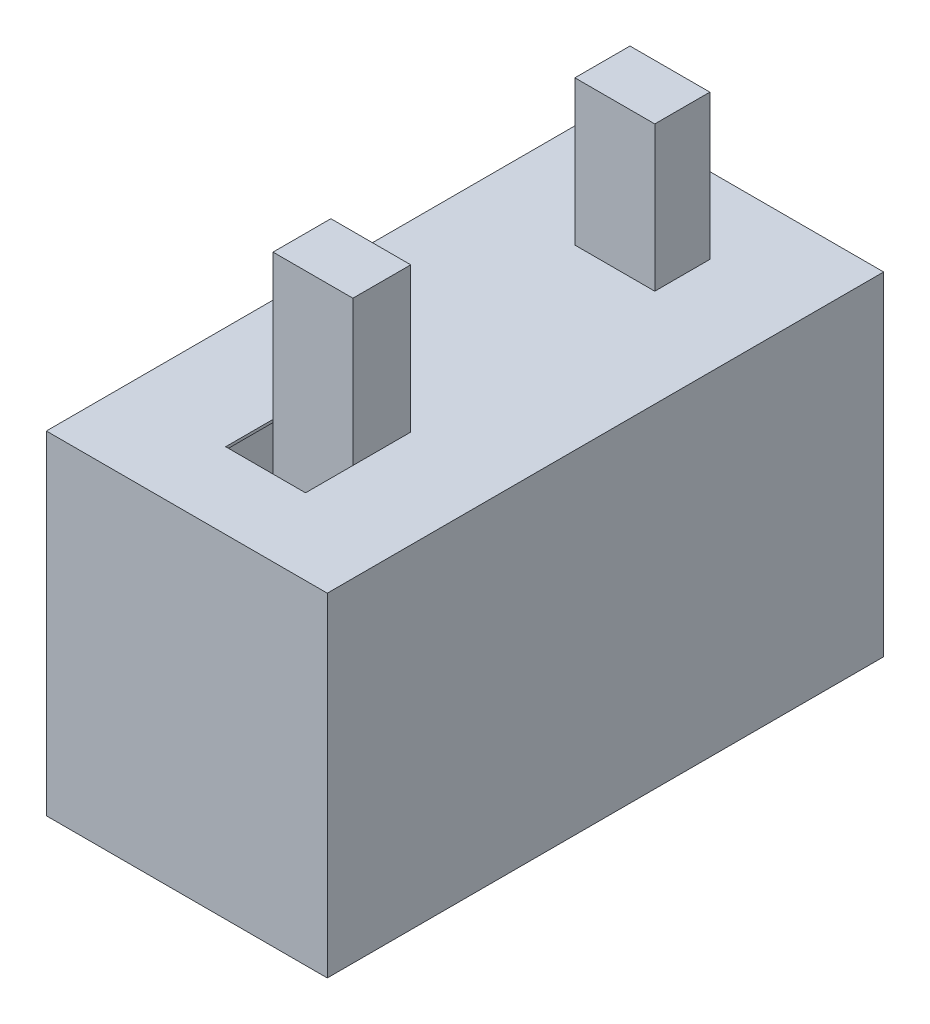
ISO-10303-21;
HEADER;
FILE_DESCRIPTION(('STEP AP214'),'2;1');
FILE_NAME('part.step','',(''),(''),'','','');
FILE_SCHEMA(('AUTOMOTIVE_DESIGN { 1 0 10303 214 1 1 1 1 }'));
ENDSEC;
DATA;
#1=APPLICATION_CONTEXT('core data for automotive mechanical design processes');
#2=APPLICATION_PROTOCOL_DEFINITION('international standard','automotive_design',2000,#1);
#3=PRODUCT_CONTEXT('',#1,'mechanical');
#4=PRODUCT('Part','Part','',(#3));
#5=PRODUCT_RELATED_PRODUCT_CATEGORY('part','',(#4));
#6=PRODUCT_DEFINITION_FORMATION('','',#4);
#7=PRODUCT_DEFINITION_CONTEXT('part definition',#1,'design');
#8=PRODUCT_DEFINITION('design','',#6,#7);
#9=PRODUCT_DEFINITION_SHAPE('','',#8);
#10=(LENGTH_UNIT() NAMED_UNIT(*) SI_UNIT(.MILLI.,.METRE.));
#11=(NAMED_UNIT(*) PLANE_ANGLE_UNIT() SI_UNIT($,.RADIAN.));
#12=(NAMED_UNIT(*) SI_UNIT($,.STERADIAN.) SOLID_ANGLE_UNIT());
#13=UNCERTAINTY_MEASURE_WITH_UNIT(LENGTH_MEASURE(1.E-05),#10,'distance_accuracy_value','');
#14=(GEOMETRIC_REPRESENTATION_CONTEXT(3) GLOBAL_UNCERTAINTY_ASSIGNED_CONTEXT((#13)) GLOBAL_UNIT_ASSIGNED_CONTEXT((#10,
#11,#12)) REPRESENTATION_CONTEXT('',''));
#15=CARTESIAN_POINT('',(0.,0.,0.));
#16=DIRECTION('',(0.,0.,1.));
#17=DIRECTION('',(1.,0.,0.));
#18=AXIS2_PLACEMENT_3D('',#15,#16,#17);
#19=CARTESIAN_POINT('',(0.,5.,0.));
#20=DIRECTION('',(0.,1.,0.));
#21=DIRECTION('',(0.,0.,1.));
#22=AXIS2_PLACEMENT_3D('',#19,#20,#21);
#23=PLANE('',#22);
#24=DIRECTION('',(1.,0.,0.));
#25=VECTOR('',#24,1.);
#26=CARTESIAN_POINT('',(131.763257583593,5.,138.525758022132));
#27=LINE('',#26,#25);
#28=CARTESIAN_POINT('',(131.763257583593,5.,138.525758022132));
#29=VERTEX_POINT('',#28);
#30=CARTESIAN_POINT('',(276.763257583593,5.,138.525758022132));
#31=VERTEX_POINT('',#30);
#32=EDGE_CURVE('E752',#29,#31,#27,.T.);
#33=ORIENTED_EDGE('',*,*,#32,.F.);
#34=DIRECTION('',(0.,0.,1.));
#35=VECTOR('',#34,1.);
#36=CARTESIAN_POINT('',(131.763257583593,5.,38.5257580221315));
#37=LINE('',#36,#35);
#38=CARTESIAN_POINT('',(131.763257583593,5.,38.5257580221315));
#39=VERTEX_POINT('',#38);
#40=EDGE_CURVE('E237',#39,#29,#37,.T.);
#41=ORIENTED_EDGE('',*,*,#40,.F.);
#42=DIRECTION('',(-1.,0.,0.));
#43=VECTOR('',#42,1.);
#44=CARTESIAN_POINT('',(131.763257583593,5.,38.5257580221315));
#45=LINE('',#44,#43);
#46=CARTESIAN_POINT('',(276.763257583593,5.,38.5257580221315));
#47=VERTEX_POINT('',#46);
#48=EDGE_CURVE('E748',#47,#39,#45,.T.);
#49=ORIENTED_EDGE('',*,*,#48,.F.);
#50=DIRECTION('',(0.,0.,-1.));
#51=VECTOR('',#50,1.);
#52=CARTESIAN_POINT('',(276.763257583593,5.,38.5257580221315));
#53=LINE('',#52,#51);
#54=EDGE_CURVE('E712',#31,#47,#53,.T.);
#55=ORIENTED_EDGE('',*,*,#54,.F.);
#56=EDGE_LOOP('',(#33,#41,#49,#55));
#57=FACE_BOUND('',#56,.T.);
#58=DIRECTION('',(0.,0.,1.));
#59=VECTOR('',#58,1.);
#60=CARTESIAN_POINT('',(-50.7367424164072,5.,-94.4742419778685));
#61=LINE('',#60,#59);
#62=CARTESIAN_POINT('',(-50.7367424164072,5.,-94.4742419778685));
#63=VERTEX_POINT('',#62);
#64=CARTESIAN_POINT('',(-50.7367424164071,5.,905.525758022132));
#65=VERTEX_POINT('',#64);
#66=EDGE_CURVE('E294',#63,#65,#61,.T.);
#67=ORIENTED_EDGE('',*,*,#66,.T.);
#68=DIRECTION('',(1.,0.,0.));
#69=VECTOR('',#68,1.);
#70=CARTESIAN_POINT('',(-50.7367424164071,5.,905.525758022132));
#71=LINE('',#70,#69);
#72=CARTESIAN_POINT('',(449.263257583593,5.,905.525758022132));
#73=VERTEX_POINT('',#72);
#74=EDGE_CURVE('E310',#65,#73,#71,.T.);
#75=ORIENTED_EDGE('',*,*,#74,.T.);
#76=DIRECTION('',(0.,0.,-1.));
#77=VECTOR('',#76,1.);
#78=CARTESIAN_POINT('',(449.263257583593,5.,-94.4742419778685));
#79=LINE('',#78,#77);
#80=CARTESIAN_POINT('',(449.263257583593,5.,-94.4742419778685));
#81=VERTEX_POINT('',#80);
#82=EDGE_CURVE('E312',#73,#81,#79,.T.);
#83=ORIENTED_EDGE('',*,*,#82,.T.);
#84=DIRECTION('',(-1.,0.,0.));
#85=VECTOR('',#84,1.);
#86=CARTESIAN_POINT('',(-50.7367424164072,5.,-94.4742419778685));
#87=LINE('',#86,#85);
#88=EDGE_CURVE('E299',#81,#63,#87,.T.);
#89=ORIENTED_EDGE('',*,*,#88,.T.);
#90=EDGE_LOOP('',(#67,#75,#83,#89));
#91=FACE_BOUND('',#90,.T.);
#92=DIRECTION('',(1.,0.,0.));
#93=VECTOR('',#92,1.);
#94=CARTESIAN_POINT('',(131.763257583593,5.,686.525758022132));
#95=LINE('',#94,#93);
#96=CARTESIAN_POINT('',(131.763257583593,5.,686.525758022132));
#97=VERTEX_POINT('',#96);
#98=CARTESIAN_POINT('',(276.763257583593,5.,686.525758022132));
#99=VERTEX_POINT('',#98);
#100=EDGE_CURVE('E261',#97,#99,#95,.T.);
#101=ORIENTED_EDGE('',*,*,#100,.F.);
#102=DIRECTION('',(0.,0.,1.));
#103=VECTOR('',#102,1.);
#104=CARTESIAN_POINT('',(131.763257583593,5.,581.525758022132));
#105=LINE('',#104,#103);
#106=CARTESIAN_POINT('',(131.763257583593,5.,581.525758022132));
#107=VERTEX_POINT('',#106);
#108=EDGE_CURVE('E263',#107,#97,#105,.T.);
#109=ORIENTED_EDGE('',*,*,#108,.F.);
#110=DIRECTION('',(-1.,0.,0.));
#111=VECTOR('',#110,1.);
#112=CARTESIAN_POINT('',(131.763257583593,5.,581.525758022132));
#113=LINE('',#112,#111);
#114=CARTESIAN_POINT('',(276.763257583593,5.,581.525758022132));
#115=VERTEX_POINT('',#114);
#116=EDGE_CURVE('E227',#115,#107,#113,.T.);
#117=ORIENTED_EDGE('',*,*,#116,.F.);
#118=DIRECTION('',(0.,0.,-1.));
#119=VECTOR('',#118,1.);
#120=CARTESIAN_POINT('',(276.763257583593,5.,581.525758022132));
#121=LINE('',#120,#119);
#122=EDGE_CURVE('E48',#99,#115,#121,.T.);
#123=ORIENTED_EDGE('',*,*,#122,.F.);
#124=EDGE_LOOP('',(#101,#109,#117,#123));
#125=FACE_BOUND('',#124,.T.);
#126=ADVANCED_FACE('F33',(#57,#91,#125),#23,.T.);
#127=CARTESIAN_POINT('',(131.763257583593,595.,581.525758022132));
#128=DIRECTION('',(-1.,0.,0.));
#129=DIRECTION('',(0.,0.,1.));
#130=AXIS2_PLACEMENT_3D('',#127,#128,#129);
#131=PLANE('',#130);
#132=DIRECTION('',(0.,-1.,0.));
#133=VECTOR('',#132,1.);
#134=CARTESIAN_POINT('',(131.763257583593,868.,686.525758022132));
#135=LINE('',#134,#133);
#136=CARTESIAN_POINT('',(131.763257583593,605.,686.525758022132));
#137=VERTEX_POINT('',#136);
#138=CARTESIAN_POINT('',(131.763257583593,600.,686.525758022132));
#139=VERTEX_POINT('',#138);
#140=EDGE_CURVE('E233',#137,#139,#135,.T.);
#141=ORIENTED_EDGE('',*,*,#140,.F.);
#142=DIRECTION('',(0.,0.,1.));
#143=VECTOR('',#142,1.);
#144=CARTESIAN_POINT('',(131.763257583593,605.,581.525758022132));
#145=LINE('',#144,#143);
#146=CARTESIAN_POINT('',(131.763257583593,605.,772.525758022132));
#147=VERTEX_POINT('',#146);
#148=EDGE_CURVE('E366',#137,#147,#145,.T.);
#149=ORIENTED_EDGE('',*,*,#148,.T.);
#150=DIRECTION('',(0.,1.,0.));
#151=VECTOR('',#150,1.);
#152=CARTESIAN_POINT('',(131.763257583593,595.,772.525758022132));
#153=LINE('',#152,#151);
#154=CARTESIAN_POINT('',(131.763257583593,600.,772.525758022132));
#155=VERTEX_POINT('',#154);
#156=EDGE_CURVE('E271',#155,#147,#153,.T.);
#157=ORIENTED_EDGE('',*,*,#156,.F.);
#158=DIRECTION('',(0.,0.,1.));
#159=VECTOR('',#158,1.);
#160=CARTESIAN_POINT('',(131.763257583593,600.,0.));
#161=LINE('',#160,#159);
#162=EDGE_CURVE('E41',#139,#155,#161,.T.);
#163=ORIENTED_EDGE('',*,*,#162,.F.);
#164=EDGE_LOOP('',(#141,#149,#157,#163));
#165=FACE_BOUND('',#164,.T.);
#166=ADVANCED_FACE('F364',(#165),#131,.F.);
#167=CARTESIAN_POINT('',(276.763257583593,595.,581.525758022132));
#168=DIRECTION('',(1.,0.,0.));
#169=DIRECTION('',(0.,0.,-1.));
#170=AXIS2_PLACEMENT_3D('',#167,#168,#169);
#171=PLANE('',#170);
#172=DIRECTION('',(0.,-1.,0.));
#173=VECTOR('',#172,1.);
#174=CARTESIAN_POINT('',(276.763257583593,868.,686.525758022132));
#175=LINE('',#174,#173);
#176=CARTESIAN_POINT('',(276.763257583593,605.,686.525758022132));
#177=VERTEX_POINT('',#176);
#178=CARTESIAN_POINT('',(276.763257583593,600.,686.525758022132));
#179=VERTEX_POINT('',#178);
#180=EDGE_CURVE('E242',#177,#179,#175,.T.);
#181=ORIENTED_EDGE('',*,*,#180,.T.);
#182=DIRECTION('',(0.,0.,-1.));
#183=VECTOR('',#182,1.);
#184=CARTESIAN_POINT('',(276.763257583593,600.,0.));
#185=LINE('',#184,#183);
#186=CARTESIAN_POINT('',(276.763257583593,600.,772.525758022132));
#187=VERTEX_POINT('',#186);
#188=EDGE_CURVE('E350',#187,#179,#185,.T.);
#189=ORIENTED_EDGE('',*,*,#188,.F.);
#190=DIRECTION('',(0.,1.,0.));
#191=VECTOR('',#190,1.);
#192=CARTESIAN_POINT('',(276.763257583593,595.,772.525758022132));
#193=LINE('',#192,#191);
#194=CARTESIAN_POINT('',(276.763257583593,605.,772.525758022132));
#195=VERTEX_POINT('',#194);
#196=EDGE_CURVE('E275',#187,#195,#193,.T.);
#197=ORIENTED_EDGE('',*,*,#196,.T.);
#198=DIRECTION('',(0.,0.,-1.));
#199=VECTOR('',#198,1.);
#200=CARTESIAN_POINT('',(276.763257583593,605.,581.525758022132));
#201=LINE('',#200,#199);
#202=EDGE_CURVE('E272',#195,#177,#201,.T.);
#203=ORIENTED_EDGE('',*,*,#202,.T.);
#204=EDGE_LOOP('',(#181,#189,#197,#203));
#205=FACE_BOUND('',#204,.T.);
#206=ADVANCED_FACE('F378',(#205),#171,.F.);
#207=CARTESIAN_POINT('',(-50.7367424164072,600.,-94.4742419778685));
#208=DIRECTION('',(0.,0.,1.));
#209=DIRECTION('',(1.,0.,0.));
#210=AXIS2_PLACEMENT_3D('',#207,#208,#209);
#211=PLANE('',#210);
#212=ORIENTED_EDGE('',*,*,#88,.F.);
#213=DIRECTION('',(0.,-1.,0.));
#214=VECTOR('',#213,1.);
#215=CARTESIAN_POINT('',(449.263257583593,600.,-94.4742419778685));
#216=LINE('',#215,#214);
#217=CARTESIAN_POINT('',(449.263257583593,600.,-94.4742419778685));
#218=VERTEX_POINT('',#217);
#219=EDGE_CURVE('E317',#218,#81,#216,.T.);
#220=ORIENTED_EDGE('',*,*,#219,.F.);
#221=DIRECTION('',(-1.,0.,0.));
#222=VECTOR('',#221,1.);
#223=CARTESIAN_POINT('',(-50.7367424164072,600.,-94.4742419778685));
#224=LINE('',#223,#222);
#225=CARTESIAN_POINT('',(-50.7367424164072,600.,-94.4742419778685));
#226=VERTEX_POINT('',#225);
#227=EDGE_CURVE('E305',#218,#226,#224,.T.);
#228=ORIENTED_EDGE('',*,*,#227,.T.);
#229=DIRECTION('',(0.,-1.,0.));
#230=VECTOR('',#229,1.);
#231=CARTESIAN_POINT('',(-50.7367424164072,600.,-94.4742419778685));
#232=LINE('',#231,#230);
#233=EDGE_CURVE('E308',#226,#63,#232,.T.);
#234=ORIENTED_EDGE('',*,*,#233,.T.);
#235=EDGE_LOOP('',(#212,#220,#228,#234));
#236=FACE_BOUND('',#235,.T.);
#237=ADVANCED_FACE('F453',(#236),#211,.T.);
#238=CARTESIAN_POINT('',(449.263257583593,600.,-94.4742419778685));
#239=DIRECTION('',(-1.,0.,0.));
#240=DIRECTION('',(0.,0.,1.));
#241=AXIS2_PLACEMENT_3D('',#238,#239,#240);
#242=PLANE('',#241);
#243=ORIENTED_EDGE('',*,*,#82,.F.);
#244=DIRECTION('',(0.,-1.,0.));
#245=VECTOR('',#244,1.);
#246=CARTESIAN_POINT('',(449.263257583593,600.,905.525758022132));
#247=LINE('',#246,#245);
#248=CARTESIAN_POINT('',(449.263257583593,600.,905.525758022131));
#249=VERTEX_POINT('',#248);
#250=EDGE_CURVE('E320',#249,#73,#247,.T.);
#251=ORIENTED_EDGE('',*,*,#250,.F.);
#252=DIRECTION('',(0.,0.,-1.));
#253=VECTOR('',#252,1.);
#254=CARTESIAN_POINT('',(449.263257583593,600.,-94.4742419778685));
#255=LINE('',#254,#253);
#256=EDGE_CURVE('E302',#249,#218,#255,.T.);
#257=ORIENTED_EDGE('',*,*,#256,.T.);
#258=ORIENTED_EDGE('',*,*,#219,.T.);
#259=EDGE_LOOP('',(#243,#251,#257,#258));
#260=FACE_BOUND('',#259,.T.);
#261=ADVANCED_FACE('F456',(#260),#242,.T.);
#262=CARTESIAN_POINT('',(-50.7367424164071,600.,905.525758022132));
#263=DIRECTION('',(0.,0.,-1.));
#264=DIRECTION('',(-1.,0.,0.));
#265=AXIS2_PLACEMENT_3D('',#262,#263,#264);
#266=PLANE('',#265);
#267=ORIENTED_EDGE('',*,*,#74,.F.);
#268=DIRECTION('',(0.,-1.,0.));
#269=VECTOR('',#268,1.);
#270=CARTESIAN_POINT('',(-50.7367424164071,600.,905.525758022132));
#271=LINE('',#270,#269);
#272=CARTESIAN_POINT('',(-50.7367424164071,600.,905.525758022132));
#273=VERTEX_POINT('',#272);
#274=EDGE_CURVE('E323',#273,#65,#271,.T.);
#275=ORIENTED_EDGE('',*,*,#274,.F.);
#276=DIRECTION('',(1.,0.,0.));
#277=VECTOR('',#276,1.);
#278=CARTESIAN_POINT('',(-50.7367424164071,600.,905.525758022132));
#279=LINE('',#278,#277);
#280=EDGE_CURVE('E298',#273,#249,#279,.T.);
#281=ORIENTED_EDGE('',*,*,#280,.T.);
#282=ORIENTED_EDGE('',*,*,#250,.T.);
#283=EDGE_LOOP('',(#267,#275,#281,#282));
#284=FACE_BOUND('',#283,.T.);
#285=ADVANCED_FACE('F459',(#284),#266,.T.);
#286=CARTESIAN_POINT('',(-50.7367424164072,600.,-94.4742419778685));
#287=DIRECTION('',(1.,0.,0.));
#288=DIRECTION('',(0.,0.,-1.));
#289=AXIS2_PLACEMENT_3D('',#286,#287,#288);
#290=PLANE('',#289);
#291=ORIENTED_EDGE('',*,*,#66,.F.);
#292=ORIENTED_EDGE('',*,*,#233,.F.);
#293=DIRECTION('',(0.,0.,1.));
#294=VECTOR('',#293,1.);
#295=CARTESIAN_POINT('',(-50.7367424164072,600.,-94.4742419778685));
#296=LINE('',#295,#294);
#297=EDGE_CURVE('E295',#226,#273,#296,.T.);
#298=ORIENTED_EDGE('',*,*,#297,.T.);
#299=ORIENTED_EDGE('',*,*,#274,.T.);
#300=EDGE_LOOP('',(#291,#292,#298,#299));
#301=FACE_BOUND('',#300,.T.);
#302=ADVANCED_FACE('F411',(#301),#290,.T.);
#303=CARTESIAN_POINT('',(0.,600.,0.));
#304=DIRECTION('',(0.,1.,0.));
#305=DIRECTION('',(0.,0.,1.));
#306=AXIS2_PLACEMENT_3D('',#303,#304,#305);
#307=PLANE('',#306);
#308=DIRECTION('',(-1.,0.,0.));
#309=VECTOR('',#308,1.);
#310=CARTESIAN_POINT('',(0.,600.,38.5257580221315));
#311=LINE('',#310,#309);
#312=CARTESIAN_POINT('',(276.763257583593,600.,38.5257580221315));
#313=VERTEX_POINT('',#312);
#314=CARTESIAN_POINT('',(131.763257583593,600.,38.5257580221315));
#315=VERTEX_POINT('',#314);
#316=EDGE_CURVE('E371',#313,#315,#311,.T.);
#317=ORIENTED_EDGE('',*,*,#316,.T.);
#318=DIRECTION('',(0.,0.,1.));
#319=VECTOR('',#318,1.);
#320=CARTESIAN_POINT('',(131.763257583593,600.,0.));
#321=LINE('',#320,#319);
#322=CARTESIAN_POINT('',(131.763257583593,600.,138.525758022132));
#323=VERTEX_POINT('',#322);
#324=EDGE_CURVE('E367',#315,#323,#321,.T.);
#325=ORIENTED_EDGE('',*,*,#324,.T.);
#326=DIRECTION('',(1.,0.,0.));
#327=VECTOR('',#326,1.);
#328=CARTESIAN_POINT('',(0.,600.,138.525758022131));
#329=LINE('',#328,#327);
#330=CARTESIAN_POINT('',(276.763257583593,600.,138.525758022132));
#331=VERTEX_POINT('',#330);
#332=EDGE_CURVE('E720',#323,#331,#329,.T.);
#333=ORIENTED_EDGE('',*,*,#332,.T.);
#334=DIRECTION('',(0.,0.,-1.));
#335=VECTOR('',#334,1.);
#336=CARTESIAN_POINT('',(276.763257583593,600.,0.));
#337=LINE('',#336,#335);
#338=EDGE_CURVE('E709',#331,#313,#337,.T.);
#339=ORIENTED_EDGE('',*,*,#338,.T.);
#340=EDGE_LOOP('',(#317,#325,#333,#339));
#341=FACE_BOUND('',#340,.T.);
#342=DIRECTION('',(-1.,0.,0.));
#343=VECTOR('',#342,1.);
#344=CARTESIAN_POINT('',(0.,600.,581.525758022132));
#345=LINE('',#344,#343);
#346=CARTESIAN_POINT('',(276.763257583593,600.,581.525758022132));
#347=VERTEX_POINT('',#346);
#348=CARTESIAN_POINT('',(131.763257583593,600.,581.525758022132));
#349=VERTEX_POINT('',#348);
#350=EDGE_CURVE('E352',#347,#349,#345,.T.);
#351=ORIENTED_EDGE('',*,*,#350,.T.);
#352=EDGE_CURVE('E11',#349,#139,#161,.T.);
#353=ORIENTED_EDGE('',*,*,#352,.T.);
#354=ORIENTED_EDGE('',*,*,#162,.T.);
#355=DIRECTION('',(1.,0.,0.));
#356=VECTOR('',#355,1.);
#357=CARTESIAN_POINT('',(0.,600.,772.525758022132));
#358=LINE('',#357,#356);
#359=EDGE_CURVE('E347',#155,#187,#358,.T.);
#360=ORIENTED_EDGE('',*,*,#359,.T.);
#361=ORIENTED_EDGE('',*,*,#188,.T.);
#362=DIRECTION('',(0.,0.,1.));
#363=VECTOR('',#362,1.);
#364=CARTESIAN_POINT('',(276.763257583593,600.,0.));
#365=LINE('',#364,#363);
#366=EDGE_CURVE('E232',#347,#179,#365,.T.);
#367=ORIENTED_EDGE('',*,*,#366,.F.);
#368=EDGE_LOOP('',(#351,#353,#354,#360,#361,#367));
#369=FACE_BOUND('',#368,.T.);
#370=ORIENTED_EDGE('',*,*,#297,.F.);
#371=ORIENTED_EDGE('',*,*,#227,.F.);
#372=ORIENTED_EDGE('',*,*,#256,.F.);
#373=ORIENTED_EDGE('',*,*,#280,.F.);
#374=EDGE_LOOP('',(#370,#371,#372,#373));
#375=FACE_BOUND('',#374,.T.);
#376=ADVANCED_FACE('F357',(#341,#369,#375),#307,.F.);
#377=CARTESIAN_POINT('',(131.763257583593,595.,772.525758022132));
#378=DIRECTION('',(0.,0.,1.));
#379=DIRECTION('',(1.,0.,0.));
#380=AXIS2_PLACEMENT_3D('',#377,#378,#379);
#381=PLANE('',#380);
#382=ORIENTED_EDGE('',*,*,#156,.T.);
#383=DIRECTION('',(1.,0.,0.));
#384=VECTOR('',#383,1.);
#385=CARTESIAN_POINT('',(131.763257583593,605.,772.525758022132));
#386=LINE('',#385,#384);
#387=EDGE_CURVE('E369',#147,#195,#386,.T.);
#388=ORIENTED_EDGE('',*,*,#387,.T.);
#389=ORIENTED_EDGE('',*,*,#196,.F.);
#390=ORIENTED_EDGE('',*,*,#359,.F.);
#391=EDGE_LOOP('',(#382,#388,#389,#390));
#392=FACE_BOUND('',#391,.T.);
#393=ADVANCED_FACE('F360',(#392),#381,.F.);
#394=CARTESIAN_POINT('',(-55.7367424164072,5.,-99.4742419778685));
#395=DIRECTION('',(1.,0.,0.));
#396=DIRECTION('',(0.,0.,-1.));
#397=AXIS2_PLACEMENT_3D('',#394,#395,#396);
#398=PLANE('',#397);
#399=DIRECTION('',(0.,0.,1.));
#400=VECTOR('',#399,1.);
#401=CARTESIAN_POINT('',(-55.7367424164072,0.,-99.4742419778685));
#402=LINE('',#401,#400);
#403=CARTESIAN_POINT('',(-55.7367424164072,0.,-99.4742419778685));
#404=VERTEX_POINT('',#403);
#405=CARTESIAN_POINT('',(-55.7367424164071,0.,910.525758022132));
#406=VERTEX_POINT('',#405);
#407=EDGE_CURVE('E326',#404,#406,#402,.T.);
#408=ORIENTED_EDGE('',*,*,#407,.T.);
#409=DIRECTION('',(0.,-1.,0.));
#410=VECTOR('',#409,1.);
#411=CARTESIAN_POINT('',(-55.7367424164071,5.,910.525758022132));
#412=LINE('',#411,#410);
#413=CARTESIAN_POINT('',(-55.7367424164072,605.,910.525758022132));
#414=VERTEX_POINT('',#413);
#415=EDGE_CURVE('E344',#414,#406,#412,.T.);
#416=ORIENTED_EDGE('',*,*,#415,.F.);
#417=DIRECTION('',(0.,0.,1.));
#418=VECTOR('',#417,1.);
#419=CARTESIAN_POINT('',(-55.7367424164072,605.,-99.4742419778685));
#420=LINE('',#419,#418);
#421=CARTESIAN_POINT('',(-55.7367424164072,605.,-99.4742419778685));
#422=VERTEX_POINT('',#421);
#423=EDGE_CURVE('E281',#422,#414,#420,.T.);
#424=ORIENTED_EDGE('',*,*,#423,.F.);
#425=DIRECTION('',(0.,-1.,0.));
#426=VECTOR('',#425,1.);
#427=CARTESIAN_POINT('',(-55.7367424164072,5.,-99.4742419778685));
#428=LINE('',#427,#426);
#429=EDGE_CURVE('E335',#422,#404,#428,.T.);
#430=ORIENTED_EDGE('',*,*,#429,.T.);
#431=EDGE_LOOP('',(#408,#416,#424,#430));
#432=FACE_BOUND('',#431,.T.);
#433=ADVANCED_FACE('F35',(#432),#398,.F.);
#434=CARTESIAN_POINT('',(-55.7367424164071,5.,910.525758022132));
#435=DIRECTION('',(0.,0.,-1.));
#436=DIRECTION('',(-1.,0.,0.));
#437=AXIS2_PLACEMENT_3D('',#434,#435,#436);
#438=PLANE('',#437);
#439=DIRECTION('',(1.,0.,0.));
#440=VECTOR('',#439,1.);
#441=CARTESIAN_POINT('',(-55.7367424164071,0.,910.525758022132));
#442=LINE('',#441,#440);
#443=CARTESIAN_POINT('',(454.263257583593,0.,910.525758022132));
#444=VERTEX_POINT('',#443);
#445=EDGE_CURVE('E329',#406,#444,#442,.T.);
#446=ORIENTED_EDGE('',*,*,#445,.T.);
#447=DIRECTION('',(0.,-1.,0.));
#448=VECTOR('',#447,1.);
#449=CARTESIAN_POINT('',(454.263257583593,5.,910.525758022132));
#450=LINE('',#449,#448);
#451=CARTESIAN_POINT('',(454.263257583593,605.,910.525758022132));
#452=VERTEX_POINT('',#451);
#453=EDGE_CURVE('E341',#452,#444,#450,.T.);
#454=ORIENTED_EDGE('',*,*,#453,.F.);
#455=DIRECTION('',(1.,0.,0.));
#456=VECTOR('',#455,1.);
#457=CARTESIAN_POINT('',(-55.7367424164072,605.,910.525758022132));
#458=LINE('',#457,#456);
#459=EDGE_CURVE('E285',#414,#452,#458,.T.);
#460=ORIENTED_EDGE('',*,*,#459,.F.);
#461=ORIENTED_EDGE('',*,*,#415,.T.);
#462=EDGE_LOOP('',(#446,#454,#460,#461));
#463=FACE_BOUND('',#462,.T.);
#464=ADVANCED_FACE('F423',(#463),#438,.F.);
#465=CARTESIAN_POINT('',(454.263257583593,5.,-99.4742419778685));
#466=DIRECTION('',(-1.,0.,0.));
#467=DIRECTION('',(0.,0.,1.));
#468=AXIS2_PLACEMENT_3D('',#465,#466,#467);
#469=PLANE('',#468);
#470=DIRECTION('',(0.,0.,-1.));
#471=VECTOR('',#470,1.);
#472=CARTESIAN_POINT('',(454.263257583593,0.,-99.4742419778685));
#473=LINE('',#472,#471);
#474=CARTESIAN_POINT('',(454.263257583593,0.,-99.4742419778685));
#475=VERTEX_POINT('',#474);
#476=EDGE_CURVE('E331',#444,#475,#473,.T.);
#477=ORIENTED_EDGE('',*,*,#476,.T.);
#478=DIRECTION('',(0.,-1.,0.));
#479=VECTOR('',#478,1.);
#480=CARTESIAN_POINT('',(454.263257583593,5.,-99.4742419778685));
#481=LINE('',#480,#479);
#482=CARTESIAN_POINT('',(454.263257583593,605.,-99.4742419778685));
#483=VERTEX_POINT('',#482);
#484=EDGE_CURVE('E338',#483,#475,#481,.T.);
#485=ORIENTED_EDGE('',*,*,#484,.F.);
#486=DIRECTION('',(0.,0.,-1.));
#487=VECTOR('',#486,1.);
#488=CARTESIAN_POINT('',(454.263257583593,605.,-99.4742419778685));
#489=LINE('',#488,#487);
#490=EDGE_CURVE('E288',#452,#483,#489,.T.);
#491=ORIENTED_EDGE('',*,*,#490,.F.);
#492=ORIENTED_EDGE('',*,*,#453,.T.);
#493=EDGE_LOOP('',(#477,#485,#491,#492));
#494=FACE_BOUND('',#493,.T.);
#495=ADVANCED_FACE('F420',(#494),#469,.F.);
#496=CARTESIAN_POINT('',(-55.7367424164072,5.,-99.4742419778685));
#497=DIRECTION('',(0.,0.,1.));
#498=DIRECTION('',(1.,0.,0.));
#499=AXIS2_PLACEMENT_3D('',#496,#497,#498);
#500=PLANE('',#499);
#501=DIRECTION('',(-1.,0.,0.));
#502=VECTOR('',#501,1.);
#503=CARTESIAN_POINT('',(-55.7367424164072,0.,-99.4742419778685));
#504=LINE('',#503,#502);
#505=EDGE_CURVE('E333',#475,#404,#504,.T.);
#506=ORIENTED_EDGE('',*,*,#505,.T.);
#507=ORIENTED_EDGE('',*,*,#429,.F.);
#508=DIRECTION('',(-1.,0.,0.));
#509=VECTOR('',#508,1.);
#510=CARTESIAN_POINT('',(-55.7367424164072,605.,-99.4742419778685));
#511=LINE('',#510,#509);
#512=EDGE_CURVE('E291',#483,#422,#511,.T.);
#513=ORIENTED_EDGE('',*,*,#512,.F.);
#514=ORIENTED_EDGE('',*,*,#484,.T.);
#515=EDGE_LOOP('',(#506,#507,#513,#514));
#516=FACE_BOUND('',#515,.T.);
#517=ADVANCED_FACE('F416',(#516),#500,.F.);
#518=CARTESIAN_POINT('',(0.,0.,0.));
#519=DIRECTION('',(0.,1.,0.));
#520=DIRECTION('',(0.,0.,1.));
#521=AXIS2_PLACEMENT_3D('',#518,#519,#520);
#522=PLANE('',#521);
#523=ORIENTED_EDGE('',*,*,#407,.F.);
#524=ORIENTED_EDGE('',*,*,#505,.F.);
#525=ORIENTED_EDGE('',*,*,#476,.F.);
#526=ORIENTED_EDGE('',*,*,#445,.F.);
#527=EDGE_LOOP('',(#523,#524,#525,#526));
#528=FACE_BOUND('',#527,.T.);
#529=ADVANCED_FACE('F413',(#528),#522,.F.);
#530=CARTESIAN_POINT('',(0.,605.,0.));
#531=DIRECTION('',(0.,1.,0.));
#532=DIRECTION('',(0.,0.,1.));
#533=AXIS2_PLACEMENT_3D('',#530,#531,#532);
#534=PLANE('',#533);
#535=DIRECTION('',(0.,0.,1.));
#536=VECTOR('',#535,1.);
#537=CARTESIAN_POINT('',(131.763257583593,605.,38.5257580221315));
#538=LINE('',#537,#536);
#539=CARTESIAN_POINT('',(131.763257583593,605.,38.5257580221315));
#540=VERTEX_POINT('',#539);
#541=CARTESIAN_POINT('',(131.763257583593,605.,138.525758022132));
#542=VERTEX_POINT('',#541);
#543=EDGE_CURVE('E733',#540,#542,#538,.T.);
#544=ORIENTED_EDGE('',*,*,#543,.F.);
#545=DIRECTION('',(-1.,0.,0.));
#546=VECTOR('',#545,1.);
#547=CARTESIAN_POINT('',(131.763257583593,605.,38.5257580221315));
#548=LINE('',#547,#546);
#549=CARTESIAN_POINT('',(276.763257583593,605.,38.5257580221315));
#550=VERTEX_POINT('',#549);
#551=EDGE_CURVE('E722',#550,#540,#548,.T.);
#552=ORIENTED_EDGE('',*,*,#551,.F.);
#553=DIRECTION('',(0.,0.,-1.));
#554=VECTOR('',#553,1.);
#555=CARTESIAN_POINT('',(276.763257583593,605.,38.5257580221315));
#556=LINE('',#555,#554);
#557=CARTESIAN_POINT('',(276.763257583593,605.,138.525758022132));
#558=VERTEX_POINT('',#557);
#559=EDGE_CURVE('E727',#558,#550,#556,.T.);
#560=ORIENTED_EDGE('',*,*,#559,.F.);
#561=DIRECTION('',(1.,0.,0.));
#562=VECTOR('',#561,1.);
#563=CARTESIAN_POINT('',(131.763257583593,605.,138.525758022132));
#564=LINE('',#563,#562);
#565=EDGE_CURVE('E730',#542,#558,#564,.T.);
#566=ORIENTED_EDGE('',*,*,#565,.F.);
#567=EDGE_LOOP('',(#544,#552,#560,#566));
#568=FACE_BOUND('',#567,.T.);
#569=CARTESIAN_POINT('',(131.763257583593,605.,581.525758022132));
#570=VERTEX_POINT('',#569);
#571=EDGE_CURVE('E231',#570,#137,#145,.T.);
#572=ORIENTED_EDGE('',*,*,#571,.F.);
#573=DIRECTION('',(-1.,0.,0.));
#574=VECTOR('',#573,1.);
#575=CARTESIAN_POINT('',(131.763257583593,605.,581.525758022132));
#576=LINE('',#575,#574);
#577=CARTESIAN_POINT('',(276.763257583593,605.,581.525758022132));
#578=VERTEX_POINT('',#577);
#579=EDGE_CURVE('E269',#578,#570,#576,.T.);
#580=ORIENTED_EDGE('',*,*,#579,.F.);
#581=EDGE_CURVE('E267',#177,#578,#201,.T.);
#582=ORIENTED_EDGE('',*,*,#581,.F.);
#583=ORIENTED_EDGE('',*,*,#202,.F.);
#584=ORIENTED_EDGE('',*,*,#387,.F.);
#585=ORIENTED_EDGE('',*,*,#148,.F.);
#586=EDGE_LOOP('',(#572,#580,#582,#583,#584,#585));
#587=FACE_BOUND('',#586,.T.);
#588=ORIENTED_EDGE('',*,*,#423,.T.);
#589=ORIENTED_EDGE('',*,*,#459,.T.);
#590=ORIENTED_EDGE('',*,*,#490,.T.);
#591=ORIENTED_EDGE('',*,*,#512,.T.);
#592=EDGE_LOOP('',(#588,#589,#590,#591));
#593=FACE_BOUND('',#592,.T.);
#594=ADVANCED_FACE('F375',(#568,#587,#593),#534,.T.);
#595=CARTESIAN_POINT('',(0.,868.,0.));
#596=DIRECTION('',(0.,1.,0.));
#597=DIRECTION('',(0.,0.,1.));
#598=AXIS2_PLACEMENT_3D('',#595,#596,#597);
#599=PLANE('',#598);
#600=DIRECTION('',(0.,0.,1.));
#601=VECTOR('',#600,1.);
#602=CARTESIAN_POINT('',(131.763257583593,868.,38.5257580221315));
#603=LINE('',#602,#601);
#604=CARTESIAN_POINT('',(131.763257583593,868.,38.5257580221315));
#605=VERTEX_POINT('',#604);
#606=CARTESIAN_POINT('',(131.763257583593,868.,138.525758022132));
#607=VERTEX_POINT('',#606);
#608=EDGE_CURVE('E750',#605,#607,#603,.T.);
#609=ORIENTED_EDGE('',*,*,#608,.T.);
#610=DIRECTION('',(1.,0.,0.));
#611=VECTOR('',#610,1.);
#612=CARTESIAN_POINT('',(131.763257583593,868.,138.525758022132));
#613=LINE('',#612,#611);
#614=CARTESIAN_POINT('',(276.763257583593,868.,138.525758022132));
#615=VERTEX_POINT('',#614);
#616=EDGE_CURVE('E761',#607,#615,#613,.T.);
#617=ORIENTED_EDGE('',*,*,#616,.T.);
#618=DIRECTION('',(0.,0.,-1.));
#619=VECTOR('',#618,1.);
#620=CARTESIAN_POINT('',(276.763257583593,868.,38.5257580221315));
#621=LINE('',#620,#619);
#622=CARTESIAN_POINT('',(276.763257583593,868.,38.5257580221315));
#623=VERTEX_POINT('',#622);
#624=EDGE_CURVE('E759',#615,#623,#621,.T.);
#625=ORIENTED_EDGE('',*,*,#624,.T.);
#626=DIRECTION('',(-1.,0.,0.));
#627=VECTOR('',#626,1.);
#628=CARTESIAN_POINT('',(131.763257583593,868.,38.5257580221315));
#629=LINE('',#628,#627);
#630=EDGE_CURVE('E757',#623,#605,#629,.T.);
#631=ORIENTED_EDGE('',*,*,#630,.T.);
#632=EDGE_LOOP('',(#609,#617,#625,#631));
#633=FACE_BOUND('',#632,.T.);
#634=ADVANCED_FACE('F439',(#633),#599,.T.);
#635=CARTESIAN_POINT('',(131.763257583593,868.,38.5257580221315));
#636=DIRECTION('',(0.,0.,1.));
#637=DIRECTION('',(1.,0.,0.));
#638=AXIS2_PLACEMENT_3D('',#635,#636,#637);
#639=PLANE('',#638);
#640=ORIENTED_EDGE('',*,*,#551,.T.);
#641=DIRECTION('',(0.,-1.,0.));
#642=VECTOR('',#641,1.);
#643=CARTESIAN_POINT('',(131.763257583593,868.,38.5257580221315));
#644=LINE('',#643,#642);
#645=EDGE_CURVE('E716',#605,#540,#644,.T.);
#646=ORIENTED_EDGE('',*,*,#645,.F.);
#647=ORIENTED_EDGE('',*,*,#630,.F.);
#648=DIRECTION('',(0.,-1.,0.));
#649=VECTOR('',#648,1.);
#650=CARTESIAN_POINT('',(276.763257583593,868.,38.5257580221315));
#651=LINE('',#650,#649);
#652=EDGE_CURVE('E715',#623,#550,#651,.T.);
#653=ORIENTED_EDGE('',*,*,#652,.T.);
#654=EDGE_LOOP('',(#640,#646,#647,#653));
#655=FACE_BOUND('',#654,.T.);
#656=ADVANCED_FACE('F445',(#655),#639,.F.);
#657=CARTESIAN_POINT('',(276.763257583593,868.,38.5257580221315));
#658=DIRECTION('',(-1.,0.,0.));
#659=DIRECTION('',(0.,0.,1.));
#660=AXIS2_PLACEMENT_3D('',#657,#658,#659);
#661=PLANE('',#660);
#662=ORIENTED_EDGE('',*,*,#559,.T.);
#663=ORIENTED_EDGE('',*,*,#652,.F.);
#664=ORIENTED_EDGE('',*,*,#624,.F.);
#665=DIRECTION('',(0.,-1.,0.));
#666=VECTOR('',#665,1.);
#667=CARTESIAN_POINT('',(276.763257583593,868.,138.525758022132));
#668=LINE('',#667,#666);
#669=EDGE_CURVE('E740',#615,#558,#668,.T.);
#670=ORIENTED_EDGE('',*,*,#669,.T.);
#671=EDGE_LOOP('',(#662,#663,#664,#670));
#672=FACE_BOUND('',#671,.T.);
#673=ADVANCED_FACE('F585',(#672),#661,.F.);
#674=CARTESIAN_POINT('',(131.763257583593,868.,138.525758022132));
#675=DIRECTION('',(0.,0.,-1.));
#676=DIRECTION('',(-1.,0.,0.));
#677=AXIS2_PLACEMENT_3D('',#674,#675,#676);
#678=PLANE('',#677);
#679=ORIENTED_EDGE('',*,*,#565,.T.);
#680=ORIENTED_EDGE('',*,*,#669,.F.);
#681=ORIENTED_EDGE('',*,*,#616,.F.);
#682=DIRECTION('',(0.,-1.,0.));
#683=VECTOR('',#682,1.);
#684=CARTESIAN_POINT('',(131.763257583593,868.,138.525758022132));
#685=LINE('',#684,#683);
#686=EDGE_CURVE('E736',#607,#542,#685,.T.);
#687=ORIENTED_EDGE('',*,*,#686,.T.);
#688=EDGE_LOOP('',(#679,#680,#681,#687));
#689=FACE_BOUND('',#688,.T.);
#690=ADVANCED_FACE('F595',(#689),#678,.F.);
#691=CARTESIAN_POINT('',(131.763257583593,868.,38.5257580221315));
#692=DIRECTION('',(1.,0.,0.));
#693=DIRECTION('',(0.,0.,-1.));
#694=AXIS2_PLACEMENT_3D('',#691,#692,#693);
#695=PLANE('',#694);
#696=ORIENTED_EDGE('',*,*,#543,.T.);
#697=ORIENTED_EDGE('',*,*,#686,.F.);
#698=ORIENTED_EDGE('',*,*,#608,.F.);
#699=ORIENTED_EDGE('',*,*,#645,.T.);
#700=EDGE_LOOP('',(#696,#697,#698,#699));
#701=FACE_BOUND('',#700,.T.);
#702=ADVANCED_FACE('F604',(#701),#695,.F.);
#703=EDGE_CURVE('E742',#331,#31,#668,.T.);
#704=ORIENTED_EDGE('',*,*,#703,.F.);
#705=ORIENTED_EDGE('',*,*,#332,.F.);
#706=EDGE_CURVE('E739',#323,#29,#685,.T.);
#707=ORIENTED_EDGE('',*,*,#706,.T.);
#708=ORIENTED_EDGE('',*,*,#32,.T.);
#709=EDGE_LOOP('',(#704,#705,#707,#708));
#710=FACE_BOUND('',#709,.T.);
#711=ADVANCED_FACE('F607',(#710),#678,.F.);
#712=EDGE_CURVE('E747',#315,#39,#644,.T.);
#713=ORIENTED_EDGE('',*,*,#712,.F.);
#714=ORIENTED_EDGE('',*,*,#316,.F.);
#715=EDGE_CURVE('E707',#313,#47,#651,.T.);
#716=ORIENTED_EDGE('',*,*,#715,.T.);
#717=ORIENTED_EDGE('',*,*,#48,.T.);
#718=EDGE_LOOP('',(#713,#714,#716,#717));
#719=FACE_BOUND('',#718,.T.);
#720=ADVANCED_FACE('F588',(#719),#639,.F.);
#721=ORIENTED_EDGE('',*,*,#706,.F.);
#722=ORIENTED_EDGE('',*,*,#324,.F.);
#723=ORIENTED_EDGE('',*,*,#712,.T.);
#724=ORIENTED_EDGE('',*,*,#40,.T.);
#725=EDGE_LOOP('',(#721,#722,#723,#724));
#726=FACE_BOUND('',#725,.T.);
#727=ADVANCED_FACE('F616',(#726),#695,.F.);
#728=ORIENTED_EDGE('',*,*,#715,.F.);
#729=ORIENTED_EDGE('',*,*,#338,.F.);
#730=ORIENTED_EDGE('',*,*,#703,.T.);
#731=ORIENTED_EDGE('',*,*,#54,.T.);
#732=EDGE_LOOP('',(#728,#729,#730,#731));
#733=FACE_BOUND('',#732,.T.);
#734=ADVANCED_FACE('F395',(#733),#661,.F.);
#735=CARTESIAN_POINT('',(131.763257583593,868.,581.525758022132));
#736=DIRECTION('',(1.,0.,0.));
#737=DIRECTION('',(0.,0.,-1.));
#738=AXIS2_PLACEMENT_3D('',#735,#736,#737);
#739=PLANE('',#738);
#740=EDGE_CURVE('E235',#139,#97,#135,.T.);
#741=ORIENTED_EDGE('',*,*,#740,.F.);
#742=ORIENTED_EDGE('',*,*,#352,.F.);
#743=DIRECTION('',(0.,-1.,0.));
#744=VECTOR('',#743,1.);
#745=CARTESIAN_POINT('',(131.763257583593,868.,581.525758022132));
#746=LINE('',#745,#744);
#747=EDGE_CURVE('E257',#349,#107,#746,.T.);
#748=ORIENTED_EDGE('',*,*,#747,.T.);
#749=ORIENTED_EDGE('',*,*,#108,.T.);
#750=EDGE_LOOP('',(#741,#742,#748,#749));
#751=FACE_BOUND('',#750,.T.);
#752=ADVANCED_FACE('F388',(#751),#739,.F.);
#753=CARTESIAN_POINT('',(276.763257583593,868.,581.525758022132));
#754=DIRECTION('',(-1.,0.,0.));
#755=DIRECTION('',(0.,0.,1.));
#756=AXIS2_PLACEMENT_3D('',#753,#754,#755);
#757=PLANE('',#756);
#758=DIRECTION('',(0.,-1.,0.));
#759=VECTOR('',#758,1.);
#760=CARTESIAN_POINT('',(276.763257583593,868.,581.525758022132));
#761=LINE('',#760,#759);
#762=EDGE_CURVE('E250',#347,#115,#761,.T.);
#763=ORIENTED_EDGE('',*,*,#762,.F.);
#764=ORIENTED_EDGE('',*,*,#366,.T.);
#765=EDGE_CURVE('E243',#179,#99,#175,.T.);
#766=ORIENTED_EDGE('',*,*,#765,.T.);
#767=ORIENTED_EDGE('',*,*,#122,.T.);
#768=EDGE_LOOP('',(#763,#764,#766,#767));
#769=FACE_BOUND('',#768,.T.);
#770=ADVANCED_FACE('F386',(#769),#757,.F.);
#771=CARTESIAN_POINT('',(131.763257583593,868.,581.525758022132));
#772=DIRECTION('',(0.,0.,1.));
#773=DIRECTION('',(1.,0.,0.));
#774=AXIS2_PLACEMENT_3D('',#771,#772,#773);
#775=PLANE('',#774);
#776=ORIENTED_EDGE('',*,*,#747,.F.);
#777=ORIENTED_EDGE('',*,*,#350,.F.);
#778=ORIENTED_EDGE('',*,*,#762,.T.);
#779=ORIENTED_EDGE('',*,*,#116,.T.);
#780=EDGE_LOOP('',(#776,#777,#778,#779));
#781=FACE_BOUND('',#780,.T.);
#782=ADVANCED_FACE('F385',(#781),#775,.F.);
#783=ORIENTED_EDGE('',*,*,#571,.T.);
#784=CARTESIAN_POINT('',(131.763257583593,868.,686.525758022132));
#785=VERTEX_POINT('',#784);
#786=EDGE_CURVE('E211',#785,#137,#135,.T.);
#787=ORIENTED_EDGE('',*,*,#786,.F.);
#788=DIRECTION('',(0.,0.,1.));
#789=VECTOR('',#788,1.);
#790=CARTESIAN_POINT('',(131.763257583593,868.,581.525758022132));
#791=LINE('',#790,#789);
#792=CARTESIAN_POINT('',(131.763257583593,868.,581.525758022132));
#793=VERTEX_POINT('',#792);
#794=EDGE_CURVE('E218',#793,#785,#791,.T.);
#795=ORIENTED_EDGE('',*,*,#794,.F.);
#796=EDGE_CURVE('E254',#793,#570,#746,.T.);
#797=ORIENTED_EDGE('',*,*,#796,.T.);
#798=EDGE_LOOP('',(#783,#787,#795,#797));
#799=FACE_BOUND('',#798,.T.);
#800=ADVANCED_FACE('F230',(#799),#739,.F.);
#801=CARTESIAN_POINT('',(131.763257583593,868.,686.525758022132));
#802=DIRECTION('',(0.,0.,-1.));
#803=DIRECTION('',(-1.,0.,0.));
#804=AXIS2_PLACEMENT_3D('',#801,#802,#803);
#805=PLANE('',#804);
#806=ORIENTED_EDGE('',*,*,#100,.T.);
#807=ORIENTED_EDGE('',*,*,#765,.F.);
#808=ORIENTED_EDGE('',*,*,#180,.F.);
#809=CARTESIAN_POINT('',(276.763257583593,868.,686.525758022132));
#810=VERTEX_POINT('',#809);
#811=EDGE_CURVE('E214',#810,#177,#175,.T.);
#812=ORIENTED_EDGE('',*,*,#811,.F.);
#813=DIRECTION('',(1.,0.,0.));
#814=VECTOR('',#813,1.);
#815=CARTESIAN_POINT('',(131.763257583593,868.,686.525758022132));
#816=LINE('',#815,#814);
#817=EDGE_CURVE('E205',#785,#810,#816,.T.);
#818=ORIENTED_EDGE('',*,*,#817,.F.);
#819=ORIENTED_EDGE('',*,*,#786,.T.);
#820=ORIENTED_EDGE('',*,*,#140,.T.);
#821=ORIENTED_EDGE('',*,*,#740,.T.);
#822=EDGE_LOOP('',(#806,#807,#808,#812,#818,#819,#820,#821));
#823=FACE_BOUND('',#822,.T.);
#824=ADVANCED_FACE('F208',(#823),#805,.F.);
#825=ORIENTED_EDGE('',*,*,#581,.T.);
#826=CARTESIAN_POINT('',(276.763257583593,868.,581.525758022132));
#827=VERTEX_POINT('',#826);
#828=EDGE_CURVE('E247',#827,#578,#761,.T.);
#829=ORIENTED_EDGE('',*,*,#828,.F.);
#830=DIRECTION('',(0.,0.,-1.));
#831=VECTOR('',#830,1.);
#832=CARTESIAN_POINT('',(276.763257583593,868.,581.525758022132));
#833=LINE('',#832,#831);
#834=EDGE_CURVE('E217',#810,#827,#833,.T.);
#835=ORIENTED_EDGE('',*,*,#834,.F.);
#836=ORIENTED_EDGE('',*,*,#811,.T.);
#837=EDGE_LOOP('',(#825,#829,#835,#836));
#838=FACE_BOUND('',#837,.T.);
#839=ADVANCED_FACE('F266',(#838),#757,.F.);
#840=ORIENTED_EDGE('',*,*,#579,.T.);
#841=ORIENTED_EDGE('',*,*,#796,.F.);
#842=DIRECTION('',(-1.,0.,0.));
#843=VECTOR('',#842,1.);
#844=CARTESIAN_POINT('',(131.763257583593,868.,581.525758022132));
#845=LINE('',#844,#843);
#846=EDGE_CURVE('E223',#827,#793,#845,.T.);
#847=ORIENTED_EDGE('',*,*,#846,.F.);
#848=ORIENTED_EDGE('',*,*,#828,.T.);
#849=EDGE_LOOP('',(#840,#841,#847,#848));
#850=FACE_BOUND('',#849,.T.);
#851=ADVANCED_FACE('F268',(#850),#775,.F.);
#852=CARTESIAN_POINT('',(0.,868.,0.));
#853=DIRECTION('',(0.,1.,0.));
#854=DIRECTION('',(0.,0.,1.));
#855=AXIS2_PLACEMENT_3D('',#852,#853,#854);
#856=PLANE('',#855);
#857=ORIENTED_EDGE('',*,*,#794,.T.);
#858=ORIENTED_EDGE('',*,*,#817,.T.);
#859=ORIENTED_EDGE('',*,*,#834,.T.);
#860=ORIENTED_EDGE('',*,*,#846,.T.);
#861=EDGE_LOOP('',(#857,#858,#859,#860));
#862=FACE_BOUND('',#861,.T.);
#863=ADVANCED_FACE('F221',(#862),#856,.T.);
#864=CLOSED_SHELL('',(#126,#166,#206,#237,#261,#285,#302,#376,#393,#433,#464,#495,#517,#529,
#594,#634,#656,#673,#690,#702,#711,#720,#727,#734,#752,#770,#782,#800,#824,#839,#851,#863));
#865=MANIFOLD_SOLID_BREP('B2',#864);
#866=ADVANCED_BREP_SHAPE_REPRESENTATION('',(#18,#865),#14);
#867=SHAPE_DEFINITION_REPRESENTATION(#9,#866);
ENDSEC;
END-ISO-10303-21;
